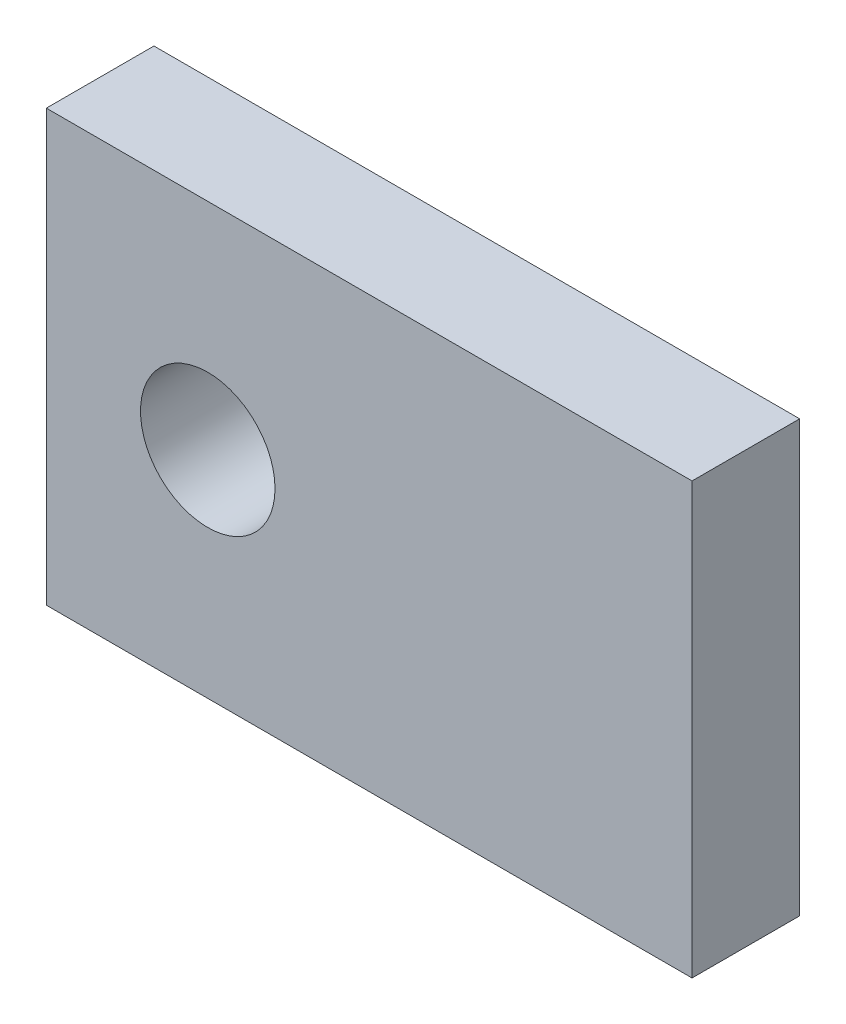
ISO-10303-21;
HEADER;
FILE_DESCRIPTION(('STEP AP214'),'2;1');
FILE_NAME('part.step','',(''),(''),'','','');
FILE_SCHEMA(('AUTOMOTIVE_DESIGN { 1 0 10303 214 1 1 1 1 }'));
ENDSEC;
DATA;
#1=APPLICATION_CONTEXT('core data for automotive mechanical design processes');
#2=APPLICATION_PROTOCOL_DEFINITION('international standard','automotive_design',2000,#1);
#3=PRODUCT_CONTEXT('',#1,'mechanical');
#4=PRODUCT('Part','Part','',(#3));
#5=PRODUCT_RELATED_PRODUCT_CATEGORY('part','',(#4));
#6=PRODUCT_DEFINITION_FORMATION('','',#4);
#7=PRODUCT_DEFINITION_CONTEXT('part definition',#1,'design');
#8=PRODUCT_DEFINITION('design','',#6,#7);
#9=PRODUCT_DEFINITION_SHAPE('','',#8);
#10=(LENGTH_UNIT() NAMED_UNIT(*) SI_UNIT(.MILLI.,.METRE.));
#11=(NAMED_UNIT(*) PLANE_ANGLE_UNIT() SI_UNIT($,.RADIAN.));
#12=(NAMED_UNIT(*) SI_UNIT($,.STERADIAN.) SOLID_ANGLE_UNIT());
#13=UNCERTAINTY_MEASURE_WITH_UNIT(LENGTH_MEASURE(1.E-05),#10,'distance_accuracy_value','');
#14=(GEOMETRIC_REPRESENTATION_CONTEXT(3) GLOBAL_UNCERTAINTY_ASSIGNED_CONTEXT((#13)) GLOBAL_UNIT_ASSIGNED_CONTEXT((#10,
#11,#12)) REPRESENTATION_CONTEXT('',''));
#15=CARTESIAN_POINT('',(0.,0.,0.));
#16=DIRECTION('',(0.,0.,1.));
#17=DIRECTION('',(1.,0.,0.));
#18=AXIS2_PLACEMENT_3D('',#15,#16,#17);
#19=CARTESIAN_POINT('',(19.05,12.7,6.35));
#20=DIRECTION('',(-1.,0.,0.));
#21=DIRECTION('',(0.,-1.,0.));
#22=AXIS2_PLACEMENT_3D('',#19,#20,#21);
#23=PLANE('',#22);
#24=DIRECTION('',(0.,1.,0.));
#25=VECTOR('',#24,1.);
#26=CARTESIAN_POINT('',(19.05,12.7,0.));
#27=LINE('',#26,#25);
#28=CARTESIAN_POINT('',(19.05,-12.7,0.));
#29=VERTEX_POINT('',#28);
#30=CARTESIAN_POINT('',(19.05,12.7,0.));
#31=VERTEX_POINT('',#30);
#32=EDGE_CURVE('E107',#29,#31,#27,.T.);
#33=ORIENTED_EDGE('',*,*,#32,.T.);
#34=DIRECTION('',(0.,0.,-1.));
#35=VECTOR('',#34,1.);
#36=CARTESIAN_POINT('',(19.05,12.7,6.35));
#37=LINE('',#36,#35);
#38=CARTESIAN_POINT('',(19.05,12.7,6.35));
#39=VERTEX_POINT('',#38);
#40=EDGE_CURVE('E11',#39,#31,#37,.T.);
#41=ORIENTED_EDGE('',*,*,#40,.F.);
#42=DIRECTION('',(0.,1.,0.));
#43=VECTOR('',#42,1.);
#44=CARTESIAN_POINT('',(19.05,12.7,6.35));
#45=LINE('',#44,#43);
#46=CARTESIAN_POINT('',(19.05,-12.7,6.35));
#47=VERTEX_POINT('',#46);
#48=EDGE_CURVE('E91',#47,#39,#45,.T.);
#49=ORIENTED_EDGE('',*,*,#48,.F.);
#50=DIRECTION('',(0.,0.,-1.));
#51=VECTOR('',#50,1.);
#52=CARTESIAN_POINT('',(19.05,-12.7,6.35));
#53=LINE('',#52,#51);
#54=EDGE_CURVE('E103',#47,#29,#53,.T.);
#55=ORIENTED_EDGE('',*,*,#54,.T.);
#56=EDGE_LOOP('',(#33,#41,#49,#55));
#57=FACE_BOUND('',#56,.T.);
#58=ADVANCED_FACE('F39',(#57),#23,.F.);
#59=CARTESIAN_POINT('',(-19.05,12.7,6.35));
#60=DIRECTION('',(0.,-1.,0.));
#61=DIRECTION('',(0.,0.,-1.));
#62=AXIS2_PLACEMENT_3D('',#59,#60,#61);
#63=PLANE('',#62);
#64=DIRECTION('',(-1.,0.,0.));
#65=VECTOR('',#64,1.);
#66=CARTESIAN_POINT('',(-19.05,12.7,0.));
#67=LINE('',#66,#65);
#68=CARTESIAN_POINT('',(-19.05,12.7,0.));
#69=VERTEX_POINT('',#68);
#70=EDGE_CURVE('E96',#31,#69,#67,.T.);
#71=ORIENTED_EDGE('',*,*,#70,.T.);
#72=DIRECTION('',(0.,0.,-1.));
#73=VECTOR('',#72,1.);
#74=CARTESIAN_POINT('',(-19.05,12.7,6.35));
#75=LINE('',#74,#73);
#76=CARTESIAN_POINT('',(-19.05,12.7,6.35));
#77=VERTEX_POINT('',#76);
#78=EDGE_CURVE('E48',#77,#69,#75,.T.);
#79=ORIENTED_EDGE('',*,*,#78,.F.);
#80=DIRECTION('',(-1.,0.,0.));
#81=VECTOR('',#80,1.);
#82=CARTESIAN_POINT('',(-19.05,12.7,6.35));
#83=LINE('',#82,#81);
#84=EDGE_CURVE('E86',#39,#77,#83,.T.);
#85=ORIENTED_EDGE('',*,*,#84,.F.);
#86=ORIENTED_EDGE('',*,*,#40,.T.);
#87=EDGE_LOOP('',(#71,#79,#85,#86));
#88=FACE_BOUND('',#87,.T.);
#89=ADVANCED_FACE('F95',(#88),#63,.F.);
#90=CARTESIAN_POINT('',(-19.05,12.7,6.35));
#91=DIRECTION('',(1.,0.,0.));
#92=DIRECTION('',(0.,1.,0.));
#93=AXIS2_PLACEMENT_3D('',#90,#91,#92);
#94=PLANE('',#93);
#95=DIRECTION('',(0.,-1.,0.));
#96=VECTOR('',#95,1.);
#97=CARTESIAN_POINT('',(-19.05,12.7,0.));
#98=LINE('',#97,#96);
#99=CARTESIAN_POINT('',(-19.05,-12.7,0.));
#100=VERTEX_POINT('',#99);
#101=EDGE_CURVE('E73',#69,#100,#98,.T.);
#102=ORIENTED_EDGE('',*,*,#101,.T.);
#103=DIRECTION('',(0.,0.,-1.));
#104=VECTOR('',#103,1.);
#105=CARTESIAN_POINT('',(-19.05,-12.7,6.35));
#106=LINE('',#105,#104);
#107=CARTESIAN_POINT('',(-19.05,-12.7,6.35));
#108=VERTEX_POINT('',#107);
#109=EDGE_CURVE('E98',#108,#100,#106,.T.);
#110=ORIENTED_EDGE('',*,*,#109,.F.);
#111=DIRECTION('',(0.,-1.,0.));
#112=VECTOR('',#111,1.);
#113=CARTESIAN_POINT('',(-19.05,12.7,6.35));
#114=LINE('',#113,#112);
#115=EDGE_CURVE('E89',#77,#108,#114,.T.);
#116=ORIENTED_EDGE('',*,*,#115,.F.);
#117=ORIENTED_EDGE('',*,*,#78,.T.);
#118=EDGE_LOOP('',(#102,#110,#116,#117));
#119=FACE_BOUND('',#118,.T.);
#120=ADVANCED_FACE('F99',(#119),#94,.F.);
#121=CARTESIAN_POINT('',(-19.05,-12.7,6.35));
#122=DIRECTION('',(0.,1.,0.));
#123=DIRECTION('',(0.,0.,1.));
#124=AXIS2_PLACEMENT_3D('',#121,#122,#123);
#125=PLANE('',#124);
#126=DIRECTION('',(1.,0.,0.));
#127=VECTOR('',#126,1.);
#128=CARTESIAN_POINT('',(-19.05,-12.7,0.));
#129=LINE('',#128,#127);
#130=EDGE_CURVE('E79',#100,#29,#129,.T.);
#131=ORIENTED_EDGE('',*,*,#130,.T.);
#132=ORIENTED_EDGE('',*,*,#54,.F.);
#133=DIRECTION('',(1.,0.,0.));
#134=VECTOR('',#133,1.);
#135=CARTESIAN_POINT('',(-19.05,-12.7,6.35));
#136=LINE('',#135,#134);
#137=EDGE_CURVE('E56',#108,#47,#136,.T.);
#138=ORIENTED_EDGE('',*,*,#137,.F.);
#139=ORIENTED_EDGE('',*,*,#109,.T.);
#140=EDGE_LOOP('',(#131,#132,#138,#139));
#141=FACE_BOUND('',#140,.T.);
#142=ADVANCED_FACE('F121',(#141),#125,.F.);
#143=CARTESIAN_POINT('',(0.,0.,6.35));
#144=DIRECTION('',(0.,0.,1.));
#145=DIRECTION('',(1.,0.,0.));
#146=AXIS2_PLACEMENT_3D('',#143,#144,#145);
#147=PLANE('',#146);
#148=CARTESIAN_POINT('',(-9.525,0.,6.35));
#149=DIRECTION('',(0.,0.,1.));
#150=DIRECTION('',(1.,0.,0.));
#151=AXIS2_PLACEMENT_3D('',#148,#149,#150);
#152=CIRCLE('',#151,3.96875);
#153=CARTESIAN_POINT('',(-5.55625,0.,6.35));
#154=VERTEX_POINT('',#153);
#155=EDGE_CURVE('E128',#154,#154,#152,.T.);
#156=ORIENTED_EDGE('',*,*,#155,.F.);
#157=EDGE_LOOP('',(#156));
#158=FACE_BOUND('',#157,.T.);
#159=ORIENTED_EDGE('',*,*,#48,.T.);
#160=ORIENTED_EDGE('',*,*,#84,.T.);
#161=ORIENTED_EDGE('',*,*,#115,.T.);
#162=ORIENTED_EDGE('',*,*,#137,.T.);
#163=EDGE_LOOP('',(#159,#160,#161,#162));
#164=FACE_BOUND('',#163,.T.);
#165=ADVANCED_FACE('F87',(#158,#164),#147,.T.);
#166=CARTESIAN_POINT('',(0.,0.,0.));
#167=DIRECTION('',(0.,0.,1.));
#168=DIRECTION('',(1.,0.,0.));
#169=AXIS2_PLACEMENT_3D('',#166,#167,#168);
#170=PLANE('',#169);
#171=CARTESIAN_POINT('',(-9.525,0.,0.));
#172=DIRECTION('',(0.,0.,1.));
#173=DIRECTION('',(1.,0.,0.));
#174=AXIS2_PLACEMENT_3D('',#171,#172,#173);
#175=CIRCLE('',#174,3.96875);
#176=CARTESIAN_POINT('',(-5.55625,0.,0.));
#177=VERTEX_POINT('',#176);
#178=EDGE_CURVE('E111',#177,#177,#175,.T.);
#179=ORIENTED_EDGE('',*,*,#178,.T.);
#180=EDGE_LOOP('',(#179));
#181=FACE_BOUND('',#180,.T.);
#182=ORIENTED_EDGE('',*,*,#32,.F.);
#183=ORIENTED_EDGE('',*,*,#130,.F.);
#184=ORIENTED_EDGE('',*,*,#101,.F.);
#185=ORIENTED_EDGE('',*,*,#70,.F.);
#186=EDGE_LOOP('',(#182,#183,#184,#185));
#187=FACE_BOUND('',#186,.T.);
#188=ADVANCED_FACE('F124',(#181,#187),#170,.F.);
#189=CARTESIAN_POINT('',(-9.525,0.,0.));
#190=DIRECTION('',(0.,0.,1.));
#191=DIRECTION('',(1.,0.,0.));
#192=AXIS2_PLACEMENT_3D('',#189,#190,#191);
#193=CYLINDRICAL_SURFACE('',#192,3.96875);
#194=ORIENTED_EDGE('',*,*,#178,.F.);
#195=EDGE_LOOP('',(#194));
#196=FACE_BOUND('',#195,.T.);
#197=ORIENTED_EDGE('',*,*,#155,.T.);
#198=EDGE_LOOP('',(#197));
#199=FACE_BOUND('',#198,.T.);
#200=ADVANCED_FACE('F137',(#196,#199),#193,.F.);
#201=CLOSED_SHELL('',(#58,#89,#120,#142,#165,#188,#200));
#202=MANIFOLD_SOLID_BREP('B2',#201);
#203=ADVANCED_BREP_SHAPE_REPRESENTATION('',(#18,#202),#14);
#204=SHAPE_DEFINITION_REPRESENTATION(#9,#203);
ENDSEC;
END-ISO-10303-21;
